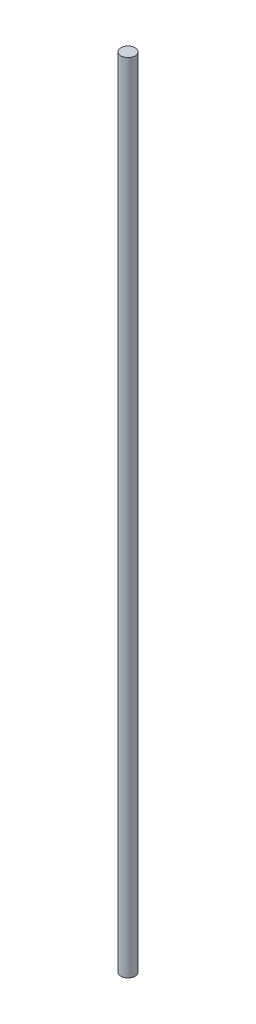
ISO-10303-21;
HEADER;
FILE_DESCRIPTION(('STEP AP214'),'2;1');
FILE_NAME('part.step','',(''),(''),'','','');
FILE_SCHEMA(('AUTOMOTIVE_DESIGN { 1 0 10303 214 1 1 1 1 }'));
ENDSEC;
DATA;
#1=APPLICATION_CONTEXT('core data for automotive mechanical design processes');
#2=APPLICATION_PROTOCOL_DEFINITION('international standard','automotive_design',2000,#1);
#3=PRODUCT_CONTEXT('',#1,'mechanical');
#4=PRODUCT('Part','Part','',(#3));
#5=PRODUCT_RELATED_PRODUCT_CATEGORY('part','',(#4));
#6=PRODUCT_DEFINITION_FORMATION('','',#4);
#7=PRODUCT_DEFINITION_CONTEXT('part definition',#1,'design');
#8=PRODUCT_DEFINITION('design','',#6,#7);
#9=PRODUCT_DEFINITION_SHAPE('','',#8);
#10=(LENGTH_UNIT() NAMED_UNIT(*) SI_UNIT(.MILLI.,.METRE.));
#11=(NAMED_UNIT(*) PLANE_ANGLE_UNIT() SI_UNIT($,.RADIAN.));
#12=(NAMED_UNIT(*) SI_UNIT($,.STERADIAN.) SOLID_ANGLE_UNIT());
#13=UNCERTAINTY_MEASURE_WITH_UNIT(LENGTH_MEASURE(1.E-05),#10,'distance_accuracy_value','');
#14=(GEOMETRIC_REPRESENTATION_CONTEXT(3) GLOBAL_UNCERTAINTY_ASSIGNED_CONTEXT((#13)) GLOBAL_UNIT_ASSIGNED_CONTEXT((#10,
#11,#12)) REPRESENTATION_CONTEXT('',''));
#15=CARTESIAN_POINT('',(0.,0.,0.));
#16=DIRECTION('',(0.,0.,1.));
#17=DIRECTION('',(1.,0.,0.));
#18=AXIS2_PLACEMENT_3D('',#15,#16,#17);
#19=CARTESIAN_POINT('',(-20.4401229268001,225.,-20.5760250900653));
#20=DIRECTION('',(0.,-1.,0.));
#21=DIRECTION('',(0.,0.,-1.));
#22=AXIS2_PLACEMENT_3D('',#19,#20,#21);
#23=CYLINDRICAL_SURFACE('',#22,2.);
#24=CARTESIAN_POINT('',(-20.4401229268001,225.,-20.5760250900653));
#25=DIRECTION('',(0.,1.,0.));
#26=DIRECTION('',(0.,0.,1.));
#27=AXIS2_PLACEMENT_3D('',#24,#25,#26);
#28=CIRCLE('',#27,2.);
#29=CARTESIAN_POINT('',(-20.4401229268001,225.,-18.5760250900653));
#30=VERTEX_POINT('',#29);
#31=EDGE_CURVE('E10',#30,#30,#28,.T.);
#32=ORIENTED_EDGE('',*,*,#31,.F.);
#33=EDGE_LOOP('',(#32));
#34=FACE_BOUND('',#33,.T.);
#35=CARTESIAN_POINT('',(-20.4401229268001,0.,-20.5760250900653));
#36=DIRECTION('',(0.,1.,0.));
#37=DIRECTION('',(0.,0.,1.));
#38=AXIS2_PLACEMENT_3D('',#35,#36,#37);
#39=CIRCLE('',#38,2.);
#40=CARTESIAN_POINT('',(-20.4401229268001,0.,-18.5760250900653));
#41=VERTEX_POINT('',#40);
#42=EDGE_CURVE('E34',#41,#41,#39,.T.);
#43=ORIENTED_EDGE('',*,*,#42,.T.);
#44=EDGE_LOOP('',(#43));
#45=FACE_BOUND('',#44,.T.);
#46=ADVANCED_FACE('F31',(#34,#45),#23,.T.);
#47=CARTESIAN_POINT('',(-20.4401229268001,225.,-20.5760250900653));
#48=DIRECTION('',(0.,1.,0.));
#49=DIRECTION('',(0.,0.,1.));
#50=AXIS2_PLACEMENT_3D('',#47,#48,#49);
#51=PLANE('',#50);
#52=ORIENTED_EDGE('',*,*,#31,.T.);
#53=EDGE_LOOP('',(#52));
#54=FACE_BOUND('',#53,.T.);
#55=ADVANCED_FACE('F46',(#54),#51,.T.);
#56=CARTESIAN_POINT('',(-20.4401229268001,0.,-20.5760250900653));
#57=DIRECTION('',(0.,1.,0.));
#58=DIRECTION('',(0.,0.,1.));
#59=AXIS2_PLACEMENT_3D('',#56,#57,#58);
#60=PLANE('',#59);
#61=ORIENTED_EDGE('',*,*,#42,.F.);
#62=EDGE_LOOP('',(#61));
#63=FACE_BOUND('',#62,.T.);
#64=ADVANCED_FACE('F44',(#63),#60,.F.);
#65=CLOSED_SHELL('',(#46,#55,#64));
#66=MANIFOLD_SOLID_BREP('B2',#65);
#67=ADVANCED_BREP_SHAPE_REPRESENTATION('',(#18,#66),#14);
#68=SHAPE_DEFINITION_REPRESENTATION(#9,#67);
ENDSEC;
END-ISO-10303-21;
